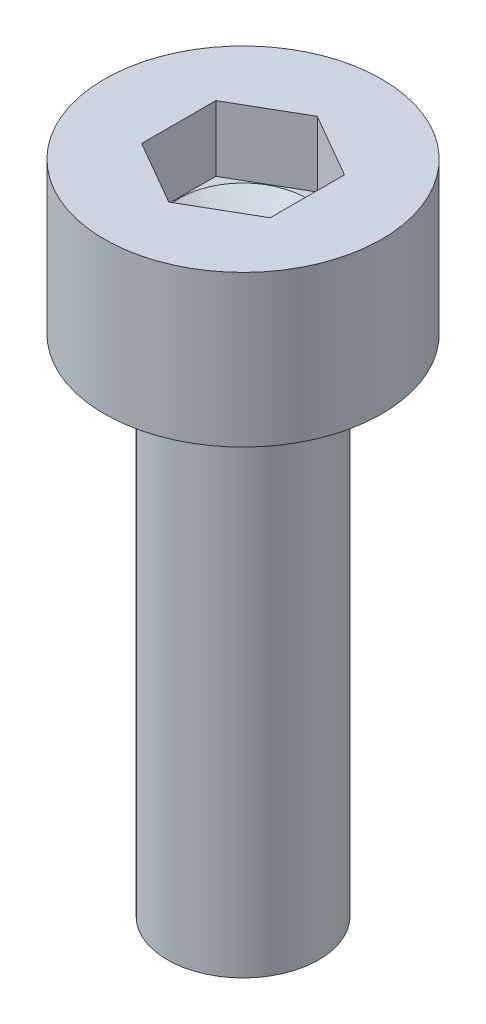
ISO-10303-21;
HEADER;
FILE_DESCRIPTION(('STEP AP214'),'2;1');
FILE_NAME('part.step','',(''),(''),'','','');
FILE_SCHEMA(('AUTOMOTIVE_DESIGN { 1 0 10303 214 1 1 1 1 }'));
ENDSEC;
DATA;
#1=APPLICATION_CONTEXT('core data for automotive mechanical design processes');
#2=APPLICATION_PROTOCOL_DEFINITION('international standard','automotive_design',2000,#1);
#3=PRODUCT_CONTEXT('',#1,'mechanical');
#4=PRODUCT('Part','Part','',(#3));
#5=PRODUCT_RELATED_PRODUCT_CATEGORY('part','',(#4));
#6=PRODUCT_DEFINITION_FORMATION('','',#4);
#7=PRODUCT_DEFINITION_CONTEXT('part definition',#1,'design');
#8=PRODUCT_DEFINITION('design','',#6,#7);
#9=PRODUCT_DEFINITION_SHAPE('','',#8);
#10=(LENGTH_UNIT() NAMED_UNIT(*) SI_UNIT(.MILLI.,.METRE.));
#11=(NAMED_UNIT(*) PLANE_ANGLE_UNIT() SI_UNIT($,.RADIAN.));
#12=(NAMED_UNIT(*) SI_UNIT($,.STERADIAN.) SOLID_ANGLE_UNIT());
#13=UNCERTAINTY_MEASURE_WITH_UNIT(LENGTH_MEASURE(1.E-05),#10,'distance_accuracy_value','');
#14=(GEOMETRIC_REPRESENTATION_CONTEXT(3) GLOBAL_UNCERTAINTY_ASSIGNED_CONTEXT((#13)) GLOBAL_UNIT_ASSIGNED_CONTEXT((#10,
#11,#12)) REPRESENTATION_CONTEXT('',''));
#15=CARTESIAN_POINT('',(0.,0.,0.));
#16=DIRECTION('',(0.,0.,1.));
#17=DIRECTION('',(1.,0.,0.));
#18=AXIS2_PLACEMENT_3D('',#15,#16,#17);
#19=CARTESIAN_POINT('',(0.,0.,0.));
#20=DIRECTION('',(0.,-1.,0.));
#21=DIRECTION('',(0.,0.,-1.));
#22=AXIS2_PLACEMENT_3D('',#19,#20,#21);
#23=PLANE('',#22);
#24=CARTESIAN_POINT('',(0.,0.,0.));
#25=DIRECTION('',(0.,-1.,0.));
#26=DIRECTION('',(0.,0.,-1.));
#27=AXIS2_PLACEMENT_3D('',#24,#25,#26);
#28=CIRCLE('',#27,2.75);
#29=CARTESIAN_POINT('',(0.,0.,-2.75));
#30=VERTEX_POINT('',#29);
#31=EDGE_CURVE('E11',#30,#30,#28,.T.);
#32=ORIENTED_EDGE('',*,*,#31,.T.);
#33=EDGE_LOOP('',(#32));
#34=FACE_BOUND('',#33,.T.);
#35=CARTESIAN_POINT('',(0.,0.,0.));
#36=DIRECTION('',(0.,-1.,0.));
#37=DIRECTION('',(0.,0.,-1.));
#38=AXIS2_PLACEMENT_3D('',#35,#36,#37);
#39=CIRCLE('',#38,1.5);
#40=CARTESIAN_POINT('',(0.,0.,-1.5));
#41=VERTEX_POINT('',#40);
#42=EDGE_CURVE('E143',#41,#41,#39,.T.);
#43=ORIENTED_EDGE('',*,*,#42,.F.);
#44=EDGE_LOOP('',(#43));
#45=FACE_BOUND('',#44,.T.);
#46=ADVANCED_FACE('F17',(#34,#45),#23,.T.);
#47=CARTESIAN_POINT('',(0.,0.,0.));
#48=DIRECTION('',(0.,-1.,0.));
#49=DIRECTION('',(0.,0.,-1.));
#50=AXIS2_PLACEMENT_3D('',#47,#48,#49);
#51=CYLINDRICAL_SURFACE('',#50,2.75);
#52=CARTESIAN_POINT('',(0.,3.,0.));
#53=DIRECTION('',(0.,-1.,0.));
#54=DIRECTION('',(0.,0.,-1.));
#55=AXIS2_PLACEMENT_3D('',#52,#53,#54);
#56=CIRCLE('',#55,2.75);
#57=CARTESIAN_POINT('',(0.,3.,-2.75));
#58=VERTEX_POINT('',#57);
#59=EDGE_CURVE('E24',#58,#58,#56,.T.);
#60=ORIENTED_EDGE('',*,*,#59,.T.);
#61=EDGE_LOOP('',(#60));
#62=FACE_BOUND('',#61,.T.);
#63=ORIENTED_EDGE('',*,*,#31,.F.);
#64=EDGE_LOOP('',(#63));
#65=FACE_BOUND('',#64,.T.);
#66=ADVANCED_FACE('F120',(#62,#65),#51,.T.);
#67=CARTESIAN_POINT('',(2.75,3.,0.));
#68=DIRECTION('',(0.,1.,0.));
#69=DIRECTION('',(0.,0.,1.));
#70=AXIS2_PLACEMENT_3D('',#67,#68,#69);
#71=PLANE('',#70);
#72=DIRECTION('',(-0.866025403784439,0.,-0.5));
#73=VECTOR('',#72,1.);
#74=CARTESIAN_POINT('',(1.275,3.,-0.736121593216773));
#75=LINE('',#74,#73);
#76=CARTESIAN_POINT('',(1.275,3.,-0.736121593216773));
#77=VERTEX_POINT('',#76);
#78=CARTESIAN_POINT('',(0.,3.,-1.47224318643355));
#79=VERTEX_POINT('',#78);
#80=EDGE_CURVE('E31',#77,#79,#75,.T.);
#81=ORIENTED_EDGE('',*,*,#80,.F.);
#82=DIRECTION('',(0.,0.,-1.));
#83=VECTOR('',#82,1.);
#84=CARTESIAN_POINT('',(1.275,3.,0.736121593216772));
#85=LINE('',#84,#83);
#86=CARTESIAN_POINT('',(1.275,3.,0.736121593216772));
#87=VERTEX_POINT('',#86);
#88=EDGE_CURVE('E101',#87,#77,#85,.T.);
#89=ORIENTED_EDGE('',*,*,#88,.F.);
#90=DIRECTION('',(0.866025403784439,0.,-0.5));
#91=VECTOR('',#90,1.);
#92=CARTESIAN_POINT('',(0.,3.,1.47224318643355));
#93=LINE('',#92,#91);
#94=CARTESIAN_POINT('',(0.,3.,1.47224318643355));
#95=VERTEX_POINT('',#94);
#96=EDGE_CURVE('E95',#95,#87,#93,.T.);
#97=ORIENTED_EDGE('',*,*,#96,.F.);
#98=DIRECTION('',(0.866025403784439,0.,0.5));
#99=VECTOR('',#98,1.);
#100=CARTESIAN_POINT('',(-1.275,3.,0.736121593216773));
#101=LINE('',#100,#99);
#102=CARTESIAN_POINT('',(-1.275,3.,0.736121593216773));
#103=VERTEX_POINT('',#102);
#104=EDGE_CURVE('E93',#103,#95,#101,.T.);
#105=ORIENTED_EDGE('',*,*,#104,.F.);
#106=DIRECTION('',(0.,0.,1.));
#107=VECTOR('',#106,1.);
#108=CARTESIAN_POINT('',(-1.275,3.,-0.736121593216773));
#109=LINE('',#108,#107);
#110=CARTESIAN_POINT('',(-1.275,3.,-0.736121593216773));
#111=VERTEX_POINT('',#110);
#112=EDGE_CURVE('E75',#111,#103,#109,.T.);
#113=ORIENTED_EDGE('',*,*,#112,.F.);
#114=DIRECTION('',(-0.866025403784439,0.,0.5));
#115=VECTOR('',#114,1.);
#116=CARTESIAN_POINT('',(0.,3.,-1.47224318643354));
#117=LINE('',#116,#115);
#118=EDGE_CURVE('E85',#79,#111,#117,.T.);
#119=ORIENTED_EDGE('',*,*,#118,.F.);
#120=EDGE_LOOP('',(#81,#89,#97,#105,#113,#119));
#121=FACE_BOUND('',#120,.T.);
#122=ORIENTED_EDGE('',*,*,#59,.F.);
#123=EDGE_LOOP('',(#122));
#124=FACE_BOUND('',#123,.T.);
#125=ADVANCED_FACE('F89',(#121,#124),#71,.T.);
#126=CARTESIAN_POINT('',(1.275,-2.19518934071246,-0.736121593216773));
#127=DIRECTION('',(0.5,0.,-0.866025403784439));
#128=DIRECTION('',(-0.866025403784439,0.,-0.5));
#129=AXIS2_PLACEMENT_3D('',#126,#127,#128);
#130=PLANE('',#129);
#131=DIRECTION('',(0.866025403784439,0.,0.5));
#132=VECTOR('',#131,1.);
#133=CARTESIAN_POINT('',(1.275,1.7,-0.736121593216773));
#134=LINE('',#133,#132);
#135=CARTESIAN_POINT('',(0.,1.7,-1.47224318643354));
#136=VERTEX_POINT('',#135);
#137=CARTESIAN_POINT('',(1.275,1.7,-0.736121593216773));
#138=VERTEX_POINT('',#137);
#139=EDGE_CURVE('E115',#136,#138,#134,.T.);
#140=ORIENTED_EDGE('',*,*,#139,.T.);
#141=DIRECTION('',(0.,1.,0.));
#142=VECTOR('',#141,1.);
#143=CARTESIAN_POINT('',(1.275,-2.19518934071246,-0.736121593216773));
#144=LINE('',#143,#142);
#145=EDGE_CURVE('E104',#138,#77,#144,.T.);
#146=ORIENTED_EDGE('',*,*,#145,.T.);
#147=ORIENTED_EDGE('',*,*,#80,.T.);
#148=DIRECTION('',(0.,1.,0.));
#149=VECTOR('',#148,1.);
#150=CARTESIAN_POINT('',(0.,-2.19518934071246,-1.47224318643354));
#151=LINE('',#150,#149);
#152=EDGE_CURVE('E82',#136,#79,#151,.T.);
#153=ORIENTED_EDGE('',*,*,#152,.F.);
#154=EDGE_LOOP('',(#140,#146,#147,#153));
#155=FACE_BOUND('',#154,.T.);
#156=ADVANCED_FACE('F123',(#155),#130,.F.);
#157=CARTESIAN_POINT('',(1.275,-2.19518934071246,0.736121593216772));
#158=DIRECTION('',(1.,0.,0.));
#159=DIRECTION('',(0.,0.,-1.));
#160=AXIS2_PLACEMENT_3D('',#157,#158,#159);
#161=PLANE('',#160);
#162=DIRECTION('',(0.,0.,1.));
#163=VECTOR('',#162,1.);
#164=CARTESIAN_POINT('',(1.275,1.7,0.736121593216772));
#165=LINE('',#164,#163);
#166=CARTESIAN_POINT('',(1.275,1.7,0.736121593216772));
#167=VERTEX_POINT('',#166);
#168=EDGE_CURVE('E155',#138,#167,#165,.T.);
#169=ORIENTED_EDGE('',*,*,#168,.T.);
#170=DIRECTION('',(0.,1.,0.));
#171=VECTOR('',#170,1.);
#172=CARTESIAN_POINT('',(1.275,-2.19518934071246,0.736121593216772));
#173=LINE('',#172,#171);
#174=EDGE_CURVE('E106',#167,#87,#173,.T.);
#175=ORIENTED_EDGE('',*,*,#174,.T.);
#176=ORIENTED_EDGE('',*,*,#88,.T.);
#177=ORIENTED_EDGE('',*,*,#145,.F.);
#178=EDGE_LOOP('',(#169,#175,#176,#177));
#179=FACE_BOUND('',#178,.T.);
#180=ADVANCED_FACE('F131',(#179),#161,.F.);
#181=CARTESIAN_POINT('',(0.,-2.19518934071246,1.47224318643355));
#182=DIRECTION('',(0.5,0.,0.866025403784438));
#183=DIRECTION('',(0.866025403784439,0.,-0.5));
#184=AXIS2_PLACEMENT_3D('',#181,#182,#183);
#185=PLANE('',#184);
#186=DIRECTION('',(-0.866025403784439,0.,0.5));
#187=VECTOR('',#186,1.);
#188=CARTESIAN_POINT('',(0.,1.7,1.47224318643355));
#189=LINE('',#188,#187);
#190=CARTESIAN_POINT('',(0.,1.7,1.47224318643355));
#191=VERTEX_POINT('',#190);
#192=EDGE_CURVE('E153',#167,#191,#189,.T.);
#193=ORIENTED_EDGE('',*,*,#192,.T.);
#194=DIRECTION('',(0.,1.,0.));
#195=VECTOR('',#194,1.);
#196=CARTESIAN_POINT('',(0.,-2.19518934071246,1.47224318643355));
#197=LINE('',#196,#195);
#198=EDGE_CURVE('E108',#191,#95,#197,.T.);
#199=ORIENTED_EDGE('',*,*,#198,.T.);
#200=ORIENTED_EDGE('',*,*,#96,.T.);
#201=ORIENTED_EDGE('',*,*,#174,.F.);
#202=EDGE_LOOP('',(#193,#199,#200,#201));
#203=FACE_BOUND('',#202,.T.);
#204=ADVANCED_FACE('F168',(#203),#185,.F.);
#205=CARTESIAN_POINT('',(-1.275,-2.19518934071246,0.736121593216773));
#206=DIRECTION('',(-0.5,0.,0.866025403784439));
#207=DIRECTION('',(0.866025403784439,0.,0.5));
#208=AXIS2_PLACEMENT_3D('',#205,#206,#207);
#209=PLANE('',#208);
#210=DIRECTION('',(-0.866025403784439,0.,-0.5));
#211=VECTOR('',#210,1.);
#212=CARTESIAN_POINT('',(-1.275,1.7,0.736121593216773));
#213=LINE('',#212,#211);
#214=CARTESIAN_POINT('',(-1.275,1.7,0.736121593216773));
#215=VERTEX_POINT('',#214);
#216=EDGE_CURVE('E151',#191,#215,#213,.T.);
#217=ORIENTED_EDGE('',*,*,#216,.T.);
#218=DIRECTION('',(0.,1.,0.));
#219=VECTOR('',#218,1.);
#220=CARTESIAN_POINT('',(-1.275,-2.19518934071246,0.736121593216773));
#221=LINE('',#220,#219);
#222=EDGE_CURVE('E81',#215,#103,#221,.T.);
#223=ORIENTED_EDGE('',*,*,#222,.T.);
#224=ORIENTED_EDGE('',*,*,#104,.T.);
#225=ORIENTED_EDGE('',*,*,#198,.F.);
#226=EDGE_LOOP('',(#217,#223,#224,#225));
#227=FACE_BOUND('',#226,.T.);
#228=ADVANCED_FACE('F171',(#227),#209,.F.);
#229=CARTESIAN_POINT('',(-1.275,-2.19518934071246,-0.736121593216773));
#230=DIRECTION('',(-1.,0.,0.));
#231=DIRECTION('',(0.,0.,1.));
#232=AXIS2_PLACEMENT_3D('',#229,#230,#231);
#233=PLANE('',#232);
#234=DIRECTION('',(0.,0.,-1.));
#235=VECTOR('',#234,1.);
#236=CARTESIAN_POINT('',(-1.275,1.7,-0.736121593216773));
#237=LINE('',#236,#235);
#238=CARTESIAN_POINT('',(-1.275,1.7,-0.736121593216773));
#239=VERTEX_POINT('',#238);
#240=EDGE_CURVE('E78',#215,#239,#237,.T.);
#241=ORIENTED_EDGE('',*,*,#240,.T.);
#242=DIRECTION('',(0.,1.,0.));
#243=VECTOR('',#242,1.);
#244=CARTESIAN_POINT('',(-1.275,-2.19518934071246,-0.736121593216773));
#245=LINE('',#244,#243);
#246=EDGE_CURVE('E70',#239,#111,#245,.T.);
#247=ORIENTED_EDGE('',*,*,#246,.T.);
#248=ORIENTED_EDGE('',*,*,#112,.T.);
#249=ORIENTED_EDGE('',*,*,#222,.F.);
#250=EDGE_LOOP('',(#241,#247,#248,#249));
#251=FACE_BOUND('',#250,.T.);
#252=ADVANCED_FACE('F72',(#251),#233,.F.);
#253=CARTESIAN_POINT('',(0.,-2.19518934071246,-1.47224318643354));
#254=DIRECTION('',(-0.5,0.,-0.866025403784439));
#255=DIRECTION('',(-0.866025403784439,0.,0.5));
#256=AXIS2_PLACEMENT_3D('',#253,#254,#255);
#257=PLANE('',#256);
#258=DIRECTION('',(0.866025403784439,0.,-0.5));
#259=VECTOR('',#258,1.);
#260=CARTESIAN_POINT('',(0.,1.7,-1.47224318643354));
#261=LINE('',#260,#259);
#262=EDGE_CURVE('E112',#239,#136,#261,.T.);
#263=ORIENTED_EDGE('',*,*,#262,.T.);
#264=ORIENTED_EDGE('',*,*,#152,.T.);
#265=ORIENTED_EDGE('',*,*,#118,.T.);
#266=ORIENTED_EDGE('',*,*,#246,.F.);
#267=EDGE_LOOP('',(#263,#264,#265,#266));
#268=FACE_BOUND('',#267,.T.);
#269=ADVANCED_FACE('F86',(#268),#257,.F.);
#270=CARTESIAN_POINT('',(0.,1.7,0.));
#271=DIRECTION('',(0.,1.,0.));
#272=DIRECTION('',(0.,0.,1.));
#273=AXIS2_PLACEMENT_3D('',#270,#271,#272);
#274=PLANE('',#273);
#275=CARTESIAN_POINT('',(0.,1.7,0.));
#276=DIRECTION('',(0.,1.,0.));
#277=DIRECTION('',(0.,0.,1.));
#278=AXIS2_PLACEMENT_3D('',#275,#276,#277);
#279=CIRCLE('',#278,1.26);
#280=CARTESIAN_POINT('',(0.,1.7,1.26));
#281=VERTEX_POINT('',#280);
#282=EDGE_CURVE('E114',#281,#281,#279,.T.);
#283=ORIENTED_EDGE('',*,*,#282,.F.);
#284=EDGE_LOOP('',(#283));
#285=FACE_BOUND('',#284,.T.);
#286=ORIENTED_EDGE('',*,*,#139,.F.);
#287=ORIENTED_EDGE('',*,*,#262,.F.);
#288=ORIENTED_EDGE('',*,*,#240,.F.);
#289=ORIENTED_EDGE('',*,*,#216,.F.);
#290=ORIENTED_EDGE('',*,*,#192,.F.);
#291=ORIENTED_EDGE('',*,*,#168,.F.);
#292=EDGE_LOOP('',(#286,#287,#288,#289,#290,#291));
#293=FACE_BOUND('',#292,.T.);
#294=ADVANCED_FACE('F162',(#285,#293),#274,.T.);
#295=CARTESIAN_POINT('',(0.,1.7,0.));
#296=DIRECTION('',(0.,1.,0.));
#297=DIRECTION('',(0.,0.,1.));
#298=AXIS2_PLACEMENT_3D('',#295,#296,#297);
#299=CONICAL_SURFACE('',#298,1.26,1.0471975511966);
#300=CARTESIAN_POINT('',(0.,0.972538660821063,0.));
#301=VERTEX_POINT('',#300);
#302=VERTEX_LOOP('',#301);
#303=FACE_BOUND('',#302,.T.);
#304=ORIENTED_EDGE('',*,*,#282,.T.);
#305=EDGE_LOOP('',(#304));
#306=FACE_BOUND('',#305,.T.);
#307=ADVANCED_FACE('F184',(#303,#306),#299,.F.);
#308=CARTESIAN_POINT('',(0.,-10.,0.));
#309=DIRECTION('',(0.,1.,0.));
#310=DIRECTION('',(0.,0.,1.));
#311=AXIS2_PLACEMENT_3D('',#308,#309,#310);
#312=CYLINDRICAL_SURFACE('',#311,1.5);
#313=CARTESIAN_POINT('',(0.,-10.,0.));
#314=DIRECTION('',(0.,-1.,0.));
#315=DIRECTION('',(0.,0.,-1.));
#316=AXIS2_PLACEMENT_3D('',#313,#314,#315);
#317=CIRCLE('',#316,1.5);
#318=CARTESIAN_POINT('',(0.,-10.,-1.5));
#319=VERTEX_POINT('',#318);
#320=EDGE_CURVE('E145',#319,#319,#317,.T.);
#321=ORIENTED_EDGE('',*,*,#320,.F.);
#322=EDGE_LOOP('',(#321));
#323=FACE_BOUND('',#322,.T.);
#324=ORIENTED_EDGE('',*,*,#42,.T.);
#325=EDGE_LOOP('',(#324));
#326=FACE_BOUND('',#325,.T.);
#327=ADVANCED_FACE('F186',(#323,#326),#312,.T.);
#328=CARTESIAN_POINT('',(0.,-10.,0.));
#329=DIRECTION('',(0.,-1.,0.));
#330=DIRECTION('',(0.,0.,-1.));
#331=AXIS2_PLACEMENT_3D('',#328,#329,#330);
#332=PLANE('',#331);
#333=ORIENTED_EDGE('',*,*,#320,.T.);
#334=EDGE_LOOP('',(#333));
#335=FACE_BOUND('',#334,.T.);
#336=ADVANCED_FACE('F192',(#335),#332,.T.);
#337=CLOSED_SHELL('',(#46,#66,#125,#156,#180,#204,#228,#252,#269,#294,#307,#327,#336));
#338=MANIFOLD_SOLID_BREP('B1',#337);
#339=ADVANCED_BREP_SHAPE_REPRESENTATION('',(#18,#338),#14);
#340=SHAPE_DEFINITION_REPRESENTATION(#9,#339);
ENDSEC;
END-ISO-10303-21;
